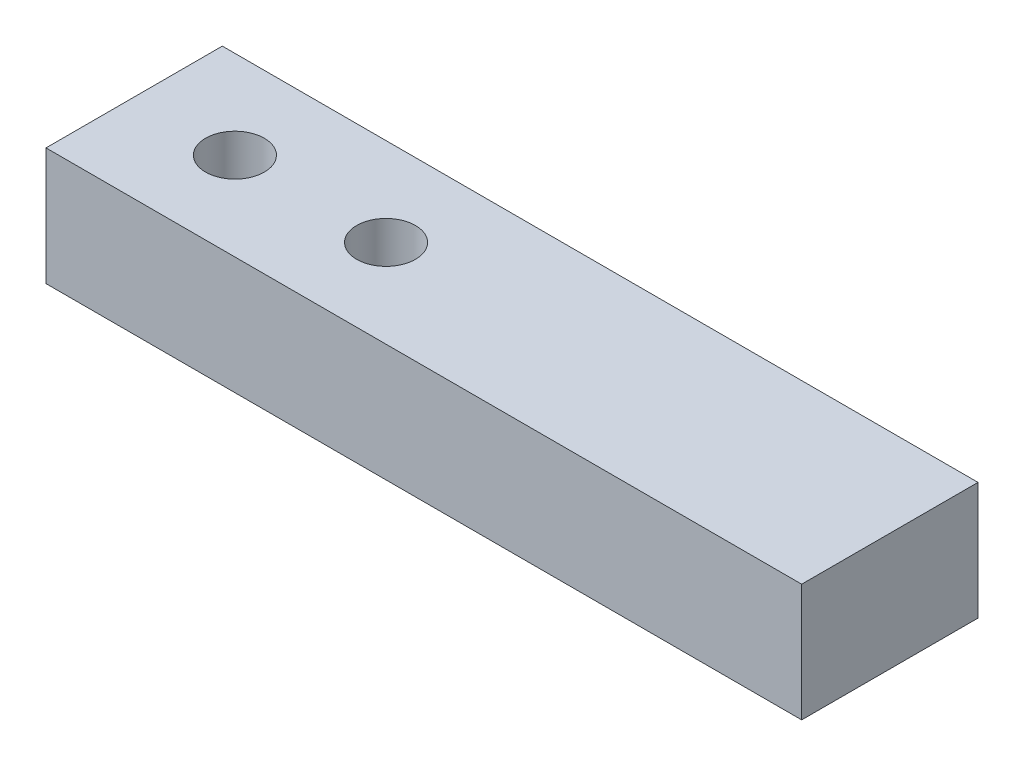
ISO-10303-21;
HEADER;
FILE_DESCRIPTION(('STEP AP214'),'2;1');
FILE_NAME('part.step','',(''),(''),'','','');
FILE_SCHEMA(('AUTOMOTIVE_DESIGN { 1 0 10303 214 1 1 1 1 }'));
ENDSEC;
DATA;
#1=APPLICATION_CONTEXT('core data for automotive mechanical design processes');
#2=APPLICATION_PROTOCOL_DEFINITION('international standard','automotive_design',2000,#1);
#3=PRODUCT_CONTEXT('',#1,'mechanical');
#4=PRODUCT('Part','Part','',(#3));
#5=PRODUCT_RELATED_PRODUCT_CATEGORY('part','',(#4));
#6=PRODUCT_DEFINITION_FORMATION('','',#4);
#7=PRODUCT_DEFINITION_CONTEXT('part definition',#1,'design');
#8=PRODUCT_DEFINITION('design','',#6,#7);
#9=PRODUCT_DEFINITION_SHAPE('','',#8);
#10=(LENGTH_UNIT() NAMED_UNIT(*) SI_UNIT(.MILLI.,.METRE.));
#11=(NAMED_UNIT(*) PLANE_ANGLE_UNIT() SI_UNIT($,.RADIAN.));
#12=(NAMED_UNIT(*) SI_UNIT($,.STERADIAN.) SOLID_ANGLE_UNIT());
#13=UNCERTAINTY_MEASURE_WITH_UNIT(LENGTH_MEASURE(1.E-05),#10,'distance_accuracy_value','');
#14=(GEOMETRIC_REPRESENTATION_CONTEXT(3) GLOBAL_UNCERTAINTY_ASSIGNED_CONTEXT((#13)) GLOBAL_UNIT_ASSIGNED_CONTEXT((#10,
#11,#12)) REPRESENTATION_CONTEXT('',''));
#15=CARTESIAN_POINT('',(0.,0.,0.));
#16=DIRECTION('',(0.,0.,1.));
#17=DIRECTION('',(1.,0.,0.));
#18=AXIS2_PLACEMENT_3D('',#15,#16,#17);
#19=CARTESIAN_POINT('',(0.,28.,0.));
#20=DIRECTION('',(0.,-1.,0.));
#21=DIRECTION('',(0.,0.,-1.));
#22=AXIS2_PLACEMENT_3D('',#19,#20,#21);
#23=PLANE('',#22);
#24=DIRECTION('',(0.,0.,-1.));
#25=VECTOR('',#24,1.);
#26=CARTESIAN_POINT('',(90.,28.,21.));
#27=LINE('',#26,#25);
#28=CARTESIAN_POINT('',(90.,28.,21.));
#29=VERTEX_POINT('',#28);
#30=CARTESIAN_POINT('',(90.,28.,-21.));
#31=VERTEX_POINT('',#30);
#32=EDGE_CURVE('E89',#29,#31,#27,.T.);
#33=ORIENTED_EDGE('',*,*,#32,.T.);
#34=DIRECTION('',(-1.,0.,0.));
#35=VECTOR('',#34,1.);
#36=CARTESIAN_POINT('',(-90.,28.,-21.));
#37=LINE('',#36,#35);
#38=CARTESIAN_POINT('',(-90.,28.,-21.));
#39=VERTEX_POINT('',#38);
#40=EDGE_CURVE('E84',#31,#39,#37,.T.);
#41=ORIENTED_EDGE('',*,*,#40,.T.);
#42=DIRECTION('',(0.,0.,1.));
#43=VECTOR('',#42,1.);
#44=CARTESIAN_POINT('',(-90.,28.,21.));
#45=LINE('',#44,#43);
#46=CARTESIAN_POINT('',(-90.,28.,21.));
#47=VERTEX_POINT('',#46);
#48=EDGE_CURVE('E87',#39,#47,#45,.T.);
#49=ORIENTED_EDGE('',*,*,#48,.T.);
#50=DIRECTION('',(1.,0.,0.));
#51=VECTOR('',#50,1.);
#52=CARTESIAN_POINT('',(-90.,28.,21.));
#53=LINE('',#52,#51);
#54=EDGE_CURVE('E54',#47,#29,#53,.T.);
#55=ORIENTED_EDGE('',*,*,#54,.T.);
#56=EDGE_LOOP('',(#33,#41,#49,#55));
#57=FACE_BOUND('',#56,.T.);
#58=CARTESIAN_POINT('',(-66.,28.,0.));
#59=DIRECTION('',(0.,1.,0.));
#60=DIRECTION('',(0.,0.,1.));
#61=AXIS2_PLACEMENT_3D('',#58,#59,#60);
#62=CIRCLE('',#61,7.);
#63=CARTESIAN_POINT('',(-66.,28.,7.));
#64=VERTEX_POINT('',#63);
#65=EDGE_CURVE('E104',#64,#64,#62,.T.);
#66=ORIENTED_EDGE('',*,*,#65,.F.);
#67=EDGE_LOOP('',(#66));
#68=FACE_BOUND('',#67,.T.);
#69=CARTESIAN_POINT('',(-30.,28.,0.));
#70=DIRECTION('',(0.,1.,0.));
#71=DIRECTION('',(0.,0.,1.));
#72=AXIS2_PLACEMENT_3D('',#69,#70,#71);
#73=CIRCLE('',#72,7.);
#74=CARTESIAN_POINT('',(-30.,28.,7.));
#75=VERTEX_POINT('',#74);
#76=EDGE_CURVE('E119',#75,#75,#73,.T.);
#77=ORIENTED_EDGE('',*,*,#76,.F.);
#78=EDGE_LOOP('',(#77));
#79=FACE_BOUND('',#78,.T.);
#80=ADVANCED_FACE('F37',(#57,#68,#79),#23,.F.);
#81=CARTESIAN_POINT('',(0.,0.,0.));
#82=DIRECTION('',(0.,-1.,0.));
#83=DIRECTION('',(0.,0.,-1.));
#84=AXIS2_PLACEMENT_3D('',#81,#82,#83);
#85=PLANE('',#84);
#86=CARTESIAN_POINT('',(-66.,0.,0.));
#87=DIRECTION('',(0.,1.,0.));
#88=DIRECTION('',(0.,0.,1.));
#89=AXIS2_PLACEMENT_3D('',#86,#87,#88);
#90=CIRCLE('',#89,7.);
#91=CARTESIAN_POINT('',(-66.,0.,7.));
#92=VERTEX_POINT('',#91);
#93=EDGE_CURVE('E116',#92,#92,#90,.T.);
#94=ORIENTED_EDGE('',*,*,#93,.T.);
#95=EDGE_LOOP('',(#94));
#96=FACE_BOUND('',#95,.T.);
#97=DIRECTION('',(0.,0.,-1.));
#98=VECTOR('',#97,1.);
#99=CARTESIAN_POINT('',(90.,0.,21.));
#100=LINE('',#99,#98);
#101=CARTESIAN_POINT('',(90.,0.,21.));
#102=VERTEX_POINT('',#101);
#103=CARTESIAN_POINT('',(90.,0.,-21.));
#104=VERTEX_POINT('',#103);
#105=EDGE_CURVE('E101',#102,#104,#100,.T.);
#106=ORIENTED_EDGE('',*,*,#105,.F.);
#107=DIRECTION('',(1.,0.,0.));
#108=VECTOR('',#107,1.);
#109=CARTESIAN_POINT('',(-90.,0.,21.));
#110=LINE('',#109,#108);
#111=CARTESIAN_POINT('',(-90.,0.,21.));
#112=VERTEX_POINT('',#111);
#113=EDGE_CURVE('E77',#112,#102,#110,.T.);
#114=ORIENTED_EDGE('',*,*,#113,.F.);
#115=DIRECTION('',(0.,0.,1.));
#116=VECTOR('',#115,1.);
#117=CARTESIAN_POINT('',(-90.,0.,21.));
#118=LINE('',#117,#116);
#119=CARTESIAN_POINT('',(-90.,0.,-21.));
#120=VERTEX_POINT('',#119);
#121=EDGE_CURVE('E71',#120,#112,#118,.T.);
#122=ORIENTED_EDGE('',*,*,#121,.F.);
#123=DIRECTION('',(-1.,0.,0.));
#124=VECTOR('',#123,1.);
#125=CARTESIAN_POINT('',(-90.,0.,-21.));
#126=LINE('',#125,#124);
#127=EDGE_CURVE('E93',#104,#120,#126,.T.);
#128=ORIENTED_EDGE('',*,*,#127,.F.);
#129=EDGE_LOOP('',(#106,#114,#122,#128));
#130=FACE_BOUND('',#129,.T.);
#131=CARTESIAN_POINT('',(-30.,0.,0.));
#132=DIRECTION('',(0.,1.,0.));
#133=DIRECTION('',(0.,0.,1.));
#134=AXIS2_PLACEMENT_3D('',#131,#132,#133);
#135=CIRCLE('',#134,7.);
#136=CARTESIAN_POINT('',(-30.,0.,7.));
#137=VERTEX_POINT('',#136);
#138=EDGE_CURVE('E122',#137,#137,#135,.T.);
#139=ORIENTED_EDGE('',*,*,#138,.T.);
#140=EDGE_LOOP('',(#139));
#141=FACE_BOUND('',#140,.T.);
#142=ADVANCED_FACE('F112',(#96,#130,#141),#85,.T.);
#143=CARTESIAN_POINT('',(90.,28.,21.));
#144=DIRECTION('',(-1.,0.,0.));
#145=DIRECTION('',(0.,0.,1.));
#146=AXIS2_PLACEMENT_3D('',#143,#144,#145);
#147=PLANE('',#146);
#148=ORIENTED_EDGE('',*,*,#105,.T.);
#149=DIRECTION('',(0.,-1.,0.));
#150=VECTOR('',#149,1.);
#151=CARTESIAN_POINT('',(90.,28.,-21.));
#152=LINE('',#151,#150);
#153=EDGE_CURVE('E11',#31,#104,#152,.T.);
#154=ORIENTED_EDGE('',*,*,#153,.F.);
#155=ORIENTED_EDGE('',*,*,#32,.F.);
#156=DIRECTION('',(0.,-1.,0.));
#157=VECTOR('',#156,1.);
#158=CARTESIAN_POINT('',(90.,28.,21.));
#159=LINE('',#158,#157);
#160=EDGE_CURVE('E97',#29,#102,#159,.T.);
#161=ORIENTED_EDGE('',*,*,#160,.T.);
#162=EDGE_LOOP('',(#148,#154,#155,#161));
#163=FACE_BOUND('',#162,.T.);
#164=ADVANCED_FACE('F39',(#163),#147,.F.);
#165=CARTESIAN_POINT('',(-90.,28.,-21.));
#166=DIRECTION('',(0.,0.,1.));
#167=DIRECTION('',(1.,0.,0.));
#168=AXIS2_PLACEMENT_3D('',#165,#166,#167);
#169=PLANE('',#168);
#170=ORIENTED_EDGE('',*,*,#127,.T.);
#171=DIRECTION('',(0.,-1.,0.));
#172=VECTOR('',#171,1.);
#173=CARTESIAN_POINT('',(-90.,28.,-21.));
#174=LINE('',#173,#172);
#175=EDGE_CURVE('E46',#39,#120,#174,.T.);
#176=ORIENTED_EDGE('',*,*,#175,.F.);
#177=ORIENTED_EDGE('',*,*,#40,.F.);
#178=ORIENTED_EDGE('',*,*,#153,.T.);
#179=EDGE_LOOP('',(#170,#176,#177,#178));
#180=FACE_BOUND('',#179,.T.);
#181=ADVANCED_FACE('F92',(#180),#169,.F.);
#182=CARTESIAN_POINT('',(-90.,28.,21.));
#183=DIRECTION('',(1.,0.,0.));
#184=DIRECTION('',(0.,0.,-1.));
#185=AXIS2_PLACEMENT_3D('',#182,#183,#184);
#186=PLANE('',#185);
#187=ORIENTED_EDGE('',*,*,#121,.T.);
#188=DIRECTION('',(0.,-1.,0.));
#189=VECTOR('',#188,1.);
#190=CARTESIAN_POINT('',(-90.,28.,21.));
#191=LINE('',#190,#189);
#192=EDGE_CURVE('E94',#47,#112,#191,.T.);
#193=ORIENTED_EDGE('',*,*,#192,.F.);
#194=ORIENTED_EDGE('',*,*,#48,.F.);
#195=ORIENTED_EDGE('',*,*,#175,.T.);
#196=EDGE_LOOP('',(#187,#193,#194,#195));
#197=FACE_BOUND('',#196,.T.);
#198=ADVANCED_FACE('F95',(#197),#186,.F.);
#199=CARTESIAN_POINT('',(-90.,28.,21.));
#200=DIRECTION('',(0.,0.,-1.));
#201=DIRECTION('',(-1.,0.,0.));
#202=AXIS2_PLACEMENT_3D('',#199,#200,#201);
#203=PLANE('',#202);
#204=ORIENTED_EDGE('',*,*,#113,.T.);
#205=ORIENTED_EDGE('',*,*,#160,.F.);
#206=ORIENTED_EDGE('',*,*,#54,.F.);
#207=ORIENTED_EDGE('',*,*,#192,.T.);
#208=EDGE_LOOP('',(#204,#205,#206,#207));
#209=FACE_BOUND('',#208,.T.);
#210=ADVANCED_FACE('F109',(#209),#203,.F.);
#211=CARTESIAN_POINT('',(-66.,28.,0.));
#212=DIRECTION('',(0.,-1.,0.));
#213=DIRECTION('',(0.,0.,-1.));
#214=AXIS2_PLACEMENT_3D('',#211,#212,#213);
#215=CYLINDRICAL_SURFACE('',#214,7.);
#216=ORIENTED_EDGE('',*,*,#65,.T.);
#217=EDGE_LOOP('',(#216));
#218=FACE_BOUND('',#217,.T.);
#219=ORIENTED_EDGE('',*,*,#93,.F.);
#220=EDGE_LOOP('',(#219));
#221=FACE_BOUND('',#220,.T.);
#222=ADVANCED_FACE('F139',(#218,#221),#215,.F.);
#223=CARTESIAN_POINT('',(-30.,28.,0.));
#224=DIRECTION('',(0.,-1.,0.));
#225=DIRECTION('',(0.,0.,-1.));
#226=AXIS2_PLACEMENT_3D('',#223,#224,#225);
#227=CYLINDRICAL_SURFACE('',#226,7.);
#228=ORIENTED_EDGE('',*,*,#76,.T.);
#229=EDGE_LOOP('',(#228));
#230=FACE_BOUND('',#229,.T.);
#231=ORIENTED_EDGE('',*,*,#138,.F.);
#232=EDGE_LOOP('',(#231));
#233=FACE_BOUND('',#232,.T.);
#234=ADVANCED_FACE('F128',(#230,#233),#227,.F.);
#235=CLOSED_SHELL('',(#80,#142,#164,#181,#198,#210,#222,#234));
#236=MANIFOLD_SOLID_BREP('B2',#235);
#237=ADVANCED_BREP_SHAPE_REPRESENTATION('',(#18,#236),#14);
#238=SHAPE_DEFINITION_REPRESENTATION(#9,#237);
ENDSEC;
END-ISO-10303-21;
